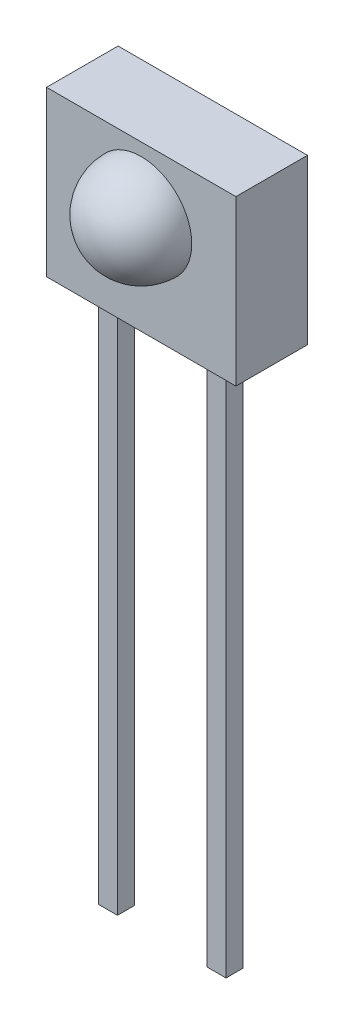
ISO-10303-21;
HEADER;
FILE_DESCRIPTION(('STEP AP214'),'2;1');
FILE_NAME('part.step','',(''),(''),'','','');
FILE_SCHEMA(('AUTOMOTIVE_DESIGN { 1 0 10303 214 1 1 1 1 }'));
ENDSEC;
DATA;
#1=APPLICATION_CONTEXT('core data for automotive mechanical design processes');
#2=APPLICATION_PROTOCOL_DEFINITION('international standard','automotive_design',2000,#1);
#3=PRODUCT_CONTEXT('',#1,'mechanical');
#4=PRODUCT('Part','Part','',(#3));
#5=PRODUCT_RELATED_PRODUCT_CATEGORY('part','',(#4));
#6=PRODUCT_DEFINITION_FORMATION('','',#4);
#7=PRODUCT_DEFINITION_CONTEXT('part definition',#1,'design');
#8=PRODUCT_DEFINITION('design','',#6,#7);
#9=PRODUCT_DEFINITION_SHAPE('','',#8);
#10=(LENGTH_UNIT() NAMED_UNIT(*) SI_UNIT(.MILLI.,.METRE.));
#11=(NAMED_UNIT(*) PLANE_ANGLE_UNIT() SI_UNIT($,.RADIAN.));
#12=(NAMED_UNIT(*) SI_UNIT($,.STERADIAN.) SOLID_ANGLE_UNIT());
#13=UNCERTAINTY_MEASURE_WITH_UNIT(LENGTH_MEASURE(1.E-05),#10,'distance_accuracy_value','');
#14=(GEOMETRIC_REPRESENTATION_CONTEXT(3) GLOBAL_UNCERTAINTY_ASSIGNED_CONTEXT((#13)) GLOBAL_UNIT_ASSIGNED_CONTEXT((#10,
#11,#12)) REPRESENTATION_CONTEXT('',''));
#15=CARTESIAN_POINT('',(0.,0.,0.));
#16=DIRECTION('',(0.,0.,1.));
#17=DIRECTION('',(1.,0.,0.));
#18=AXIS2_PLACEMENT_3D('',#15,#16,#17);
#19=CARTESIAN_POINT('',(-2.25,-1.95,-1.7));
#20=DIRECTION('',(0.,-1.,0.));
#21=DIRECTION('',(0.,0.,-1.));
#22=AXIS2_PLACEMENT_3D('',#19,#20,#21);
#23=PLANE('',#22);
#24=DIRECTION('',(0.,0.,-1.));
#25=VECTOR('',#24,1.);
#26=CARTESIAN_POINT('',(-1.065,-1.95,-0.5));
#27=LINE('',#26,#25);
#28=CARTESIAN_POINT('',(-1.065,-1.95,-0.5));
#29=VERTEX_POINT('',#28);
#30=CARTESIAN_POINT('',(-1.065,-1.95,-0.9));
#31=VERTEX_POINT('',#30);
#32=EDGE_CURVE('E124',#29,#31,#27,.T.);
#33=ORIENTED_EDGE('',*,*,#32,.T.);
#34=DIRECTION('',(-1.,0.,0.));
#35=VECTOR('',#34,1.);
#36=CARTESIAN_POINT('',(-1.065,-1.95,-0.9));
#37=LINE('',#36,#35);
#38=CARTESIAN_POINT('',(-1.515,-1.95,-0.9));
#39=VERTEX_POINT('',#38);
#40=EDGE_CURVE('E138',#31,#39,#37,.T.);
#41=ORIENTED_EDGE('',*,*,#40,.T.);
#42=DIRECTION('',(0.,0.,1.));
#43=VECTOR('',#42,1.);
#44=CARTESIAN_POINT('',(-1.515,-1.95,-0.5));
#45=LINE('',#44,#43);
#46=CARTESIAN_POINT('',(-1.515,-1.95,-0.5));
#47=VERTEX_POINT('',#46);
#48=EDGE_CURVE('E50',#39,#47,#45,.T.);
#49=ORIENTED_EDGE('',*,*,#48,.T.);
#50=DIRECTION('',(1.,0.,0.));
#51=VECTOR('',#50,1.);
#52=CARTESIAN_POINT('',(-1.065,-1.95,-0.5));
#53=LINE('',#52,#51);
#54=EDGE_CURVE('E45',#47,#29,#53,.T.);
#55=ORIENTED_EDGE('',*,*,#54,.T.);
#56=EDGE_LOOP('',(#33,#41,#49,#55));
#57=FACE_BOUND('',#56,.T.);
#58=DIRECTION('',(1.,0.,0.));
#59=VECTOR('',#58,1.);
#60=CARTESIAN_POINT('',(-2.25,-1.95,0.));
#61=LINE('',#60,#59);
#62=CARTESIAN_POINT('',(-2.25,-1.95,0.));
#63=VERTEX_POINT('',#62);
#64=CARTESIAN_POINT('',(2.25,-1.95,0.));
#65=VERTEX_POINT('',#64);
#66=EDGE_CURVE('E201',#63,#65,#61,.T.);
#67=ORIENTED_EDGE('',*,*,#66,.F.);
#68=DIRECTION('',(0.,0.,1.));
#69=VECTOR('',#68,1.);
#70=CARTESIAN_POINT('',(-2.25,-1.95,-1.7));
#71=LINE('',#70,#69);
#72=CARTESIAN_POINT('',(-2.25,-1.95,-1.7));
#73=VERTEX_POINT('',#72);
#74=EDGE_CURVE('E198',#73,#63,#71,.T.);
#75=ORIENTED_EDGE('',*,*,#74,.F.);
#76=DIRECTION('',(1.,0.,0.));
#77=VECTOR('',#76,1.);
#78=CARTESIAN_POINT('',(-2.25,-1.95,-1.7));
#79=LINE('',#78,#77);
#80=CARTESIAN_POINT('',(2.25,-1.95,-1.7));
#81=VERTEX_POINT('',#80);
#82=EDGE_CURVE('E188',#73,#81,#79,.T.);
#83=ORIENTED_EDGE('',*,*,#82,.T.);
#84=DIRECTION('',(0.,0.,1.));
#85=VECTOR('',#84,1.);
#86=CARTESIAN_POINT('',(2.25,-1.95,-1.7));
#87=LINE('',#86,#85);
#88=EDGE_CURVE('E212',#81,#65,#87,.T.);
#89=ORIENTED_EDGE('',*,*,#88,.T.);
#90=EDGE_LOOP('',(#67,#75,#83,#89));
#91=FACE_BOUND('',#90,.T.);
#92=DIRECTION('',(1.,0.,0.));
#93=VECTOR('',#92,1.);
#94=CARTESIAN_POINT('',(1.065,-1.95,-0.9));
#95=LINE('',#94,#93);
#96=CARTESIAN_POINT('',(1.065,-1.95,-0.9));
#97=VERTEX_POINT('',#96);
#98=CARTESIAN_POINT('',(1.515,-1.95,-0.9));
#99=VERTEX_POINT('',#98);
#100=EDGE_CURVE('E169',#97,#99,#95,.T.);
#101=ORIENTED_EDGE('',*,*,#100,.F.);
#102=DIRECTION('',(0.,0.,-1.));
#103=VECTOR('',#102,1.);
#104=CARTESIAN_POINT('',(1.065,-1.95,-0.5));
#105=LINE('',#104,#103);
#106=CARTESIAN_POINT('',(1.065,-1.95,-0.5));
#107=VERTEX_POINT('',#106);
#108=EDGE_CURVE('E127',#107,#97,#105,.T.);
#109=ORIENTED_EDGE('',*,*,#108,.F.);
#110=DIRECTION('',(-1.,0.,0.));
#111=VECTOR('',#110,1.);
#112=CARTESIAN_POINT('',(1.065,-1.95,-0.5));
#113=LINE('',#112,#111);
#114=CARTESIAN_POINT('',(1.515,-1.95,-0.5));
#115=VERTEX_POINT('',#114);
#116=EDGE_CURVE('E160',#115,#107,#113,.T.);
#117=ORIENTED_EDGE('',*,*,#116,.F.);
#118=DIRECTION('',(0.,0.,1.));
#119=VECTOR('',#118,1.);
#120=CARTESIAN_POINT('',(1.515,-1.95,-0.5));
#121=LINE('',#120,#119);
#122=EDGE_CURVE('E171',#99,#115,#121,.T.);
#123=ORIENTED_EDGE('',*,*,#122,.F.);
#124=EDGE_LOOP('',(#101,#109,#117,#123));
#125=FACE_BOUND('',#124,.T.);
#126=ADVANCED_FACE('F30',(#57,#91,#125),#23,.T.);
#127=CARTESIAN_POINT('',(-2.25,1.95,0.));
#128=DIRECTION('',(0.,0.,-1.));
#129=DIRECTION('',(-1.,0.,0.));
#130=AXIS2_PLACEMENT_3D('',#127,#128,#129);
#131=PLANE('',#130);
#132=DIRECTION('',(0.,-1.,0.));
#133=VECTOR('',#132,1.);
#134=CARTESIAN_POINT('',(-2.25,-1.95,0.));
#135=LINE('',#134,#133);
#136=CARTESIAN_POINT('',(-2.25,1.95,0.));
#137=VERTEX_POINT('',#136);
#138=EDGE_CURVE('E184',#137,#63,#135,.T.);
#139=ORIENTED_EDGE('',*,*,#138,.T.);
#140=ORIENTED_EDGE('',*,*,#66,.T.);
#141=DIRECTION('',(0.,1.,0.));
#142=VECTOR('',#141,1.);
#143=CARTESIAN_POINT('',(2.25,-1.95,0.));
#144=LINE('',#143,#142);
#145=CARTESIAN_POINT('',(2.25000000000001,1.95,0.));
#146=VERTEX_POINT('',#145);
#147=EDGE_CURVE('E204',#65,#146,#144,.T.);
#148=ORIENTED_EDGE('',*,*,#147,.T.);
#149=DIRECTION('',(-1.,0.,0.));
#150=VECTOR('',#149,1.);
#151=CARTESIAN_POINT('',(-2.25,1.95,0.));
#152=LINE('',#151,#150);
#153=EDGE_CURVE('E189',#146,#137,#152,.T.);
#154=ORIENTED_EDGE('',*,*,#153,.T.);
#155=EDGE_LOOP('',(#139,#140,#148,#154));
#156=FACE_BOUND('',#155,.T.);
#157=CARTESIAN_POINT('',(0.,0.449999999999996,0.));
#158=DIRECTION('',(0.,0.,-1.));
#159=DIRECTION('',(-1.,0.,0.));
#160=AXIS2_PLACEMENT_3D('',#157,#158,#159);
#161=CIRCLE('',#160,1.2);
#162=CARTESIAN_POINT('',(-1.2,0.449999999999996,0.));
#163=VERTEX_POINT('',#162);
#164=EDGE_CURVE('E11',#163,#163,#161,.F.);
#165=ORIENTED_EDGE('',*,*,#164,.F.);
#166=EDGE_LOOP('',(#165));
#167=FACE_BOUND('',#166,.T.);
#168=ADVANCED_FACE('F223',(#156,#167),#131,.F.);
#169=CARTESIAN_POINT('',(-2.25,-1.95,-1.7));
#170=DIRECTION('',(-1.,0.,0.));
#171=DIRECTION('',(0.,0.,1.));
#172=AXIS2_PLACEMENT_3D('',#169,#170,#171);
#173=PLANE('',#172);
#174=ORIENTED_EDGE('',*,*,#138,.F.);
#175=DIRECTION('',(0.,0.,1.));
#176=VECTOR('',#175,1.);
#177=CARTESIAN_POINT('',(-2.25,1.95,-1.7));
#178=LINE('',#177,#176);
#179=CARTESIAN_POINT('',(-2.25,1.95,-1.7));
#180=VERTEX_POINT('',#179);
#181=EDGE_CURVE('E38',#180,#137,#178,.T.);
#182=ORIENTED_EDGE('',*,*,#181,.F.);
#183=DIRECTION('',(0.,-1.,0.));
#184=VECTOR('',#183,1.);
#185=CARTESIAN_POINT('',(-2.25,-1.95,-1.7));
#186=LINE('',#185,#184);
#187=EDGE_CURVE('E185',#180,#73,#186,.T.);
#188=ORIENTED_EDGE('',*,*,#187,.T.);
#189=ORIENTED_EDGE('',*,*,#74,.T.);
#190=EDGE_LOOP('',(#174,#182,#188,#189));
#191=FACE_BOUND('',#190,.T.);
#192=ADVANCED_FACE('F216',(#191),#173,.T.);
#193=CARTESIAN_POINT('',(-2.25,1.95,-1.7));
#194=DIRECTION('',(0.,1.,0.));
#195=DIRECTION('',(0.,0.,1.));
#196=AXIS2_PLACEMENT_3D('',#193,#194,#195);
#197=PLANE('',#196);
#198=ORIENTED_EDGE('',*,*,#153,.F.);
#199=DIRECTION('',(0.,0.,1.));
#200=VECTOR('',#199,1.);
#201=CARTESIAN_POINT('',(2.25000000000001,1.95,-1.7));
#202=LINE('',#201,#200);
#203=CARTESIAN_POINT('',(2.25000000000001,1.95,-1.7));
#204=VERTEX_POINT('',#203);
#205=EDGE_CURVE('E210',#204,#146,#202,.T.);
#206=ORIENTED_EDGE('',*,*,#205,.F.);
#207=DIRECTION('',(-1.,0.,0.));
#208=VECTOR('',#207,1.);
#209=CARTESIAN_POINT('',(-2.25,1.95,-1.7));
#210=LINE('',#209,#208);
#211=EDGE_CURVE('E195',#204,#180,#210,.T.);
#212=ORIENTED_EDGE('',*,*,#211,.T.);
#213=ORIENTED_EDGE('',*,*,#181,.T.);
#214=EDGE_LOOP('',(#198,#206,#212,#213));
#215=FACE_BOUND('',#214,.T.);
#216=ADVANCED_FACE('F227',(#215),#197,.T.);
#217=CARTESIAN_POINT('',(2.25,-1.95,-1.7));
#218=DIRECTION('',(1.,0.,0.));
#219=DIRECTION('',(0.,1.,0.));
#220=AXIS2_PLACEMENT_3D('',#217,#218,#219);
#221=PLANE('',#220);
#222=ORIENTED_EDGE('',*,*,#147,.F.);
#223=ORIENTED_EDGE('',*,*,#88,.F.);
#224=DIRECTION('',(0.,1.,0.));
#225=VECTOR('',#224,1.);
#226=CARTESIAN_POINT('',(2.25,-1.95,-1.7));
#227=LINE('',#226,#225);
#228=EDGE_CURVE('E192',#81,#204,#227,.T.);
#229=ORIENTED_EDGE('',*,*,#228,.T.);
#230=ORIENTED_EDGE('',*,*,#205,.T.);
#231=EDGE_LOOP('',(#222,#223,#229,#230));
#232=FACE_BOUND('',#231,.T.);
#233=ADVANCED_FACE('F233',(#232),#221,.T.);
#234=CARTESIAN_POINT('',(-2.25,1.95,-1.7));
#235=DIRECTION('',(0.,0.,-1.));
#236=DIRECTION('',(-1.,0.,0.));
#237=AXIS2_PLACEMENT_3D('',#234,#235,#236);
#238=PLANE('',#237);
#239=ORIENTED_EDGE('',*,*,#187,.F.);
#240=ORIENTED_EDGE('',*,*,#211,.F.);
#241=ORIENTED_EDGE('',*,*,#228,.F.);
#242=ORIENTED_EDGE('',*,*,#82,.F.);
#243=EDGE_LOOP('',(#239,#240,#241,#242));
#244=FACE_BOUND('',#243,.T.);
#245=ADVANCED_FACE('F230',(#244),#238,.T.);
#246=CARTESIAN_POINT('',(0.,0.449999999999996,0.));
#247=DIRECTION('',(0.,0.,1.));
#248=DIRECTION('',(1.,0.,0.));
#249=AXIS2_PLACEMENT_3D('',#246,#247,#248);
#250=SPHERICAL_SURFACE('',#249,1.2);
#251=ORIENTED_EDGE('',*,*,#164,.T.);
#252=EDGE_LOOP('',(#251));
#253=FACE_BOUND('',#252,.T.);
#254=ADVANCED_FACE('F32',(#253),#250,.T.);
#255=CARTESIAN_POINT('',(1.065,-14.75,-0.5));
#256=DIRECTION('',(1.,0.,0.));
#257=DIRECTION('',(0.,0.,-1.));
#258=AXIS2_PLACEMENT_3D('',#255,#256,#257);
#259=PLANE('',#258);
#260=ORIENTED_EDGE('',*,*,#108,.T.);
#261=DIRECTION('',(0.,1.,0.));
#262=VECTOR('',#261,1.);
#263=CARTESIAN_POINT('',(1.065,-14.75,-0.9));
#264=LINE('',#263,#262);
#265=CARTESIAN_POINT('',(1.065,-14.75,-0.9));
#266=VERTEX_POINT('',#265);
#267=EDGE_CURVE('E182',#266,#97,#264,.T.);
#268=ORIENTED_EDGE('',*,*,#267,.F.);
#269=DIRECTION('',(0.,0.,-1.));
#270=VECTOR('',#269,1.);
#271=CARTESIAN_POINT('',(1.065,-14.75,-0.5));
#272=LINE('',#271,#270);
#273=CARTESIAN_POINT('',(1.065,-14.75,-0.5));
#274=VERTEX_POINT('',#273);
#275=EDGE_CURVE('E156',#274,#266,#272,.T.);
#276=ORIENTED_EDGE('',*,*,#275,.F.);
#277=DIRECTION('',(0.,1.,0.));
#278=VECTOR('',#277,1.);
#279=CARTESIAN_POINT('',(1.065,-14.75,-0.5));
#280=LINE('',#279,#278);
#281=EDGE_CURVE('E166',#274,#107,#280,.T.);
#282=ORIENTED_EDGE('',*,*,#281,.T.);
#283=EDGE_LOOP('',(#260,#268,#276,#282));
#284=FACE_BOUND('',#283,.T.);
#285=ADVANCED_FACE('F280',(#284),#259,.F.);
#286=CARTESIAN_POINT('',(1.065,-14.75,-0.9));
#287=DIRECTION('',(0.,0.,1.));
#288=DIRECTION('',(1.,0.,0.));
#289=AXIS2_PLACEMENT_3D('',#286,#287,#288);
#290=PLANE('',#289);
#291=ORIENTED_EDGE('',*,*,#100,.T.);
#292=DIRECTION('',(0.,1.,0.));
#293=VECTOR('',#292,1.);
#294=CARTESIAN_POINT('',(1.515,-14.75,-0.9));
#295=LINE('',#294,#293);
#296=CARTESIAN_POINT('',(1.515,-14.75,-0.9));
#297=VERTEX_POINT('',#296);
#298=EDGE_CURVE('E179',#297,#99,#295,.T.);
#299=ORIENTED_EDGE('',*,*,#298,.F.);
#300=DIRECTION('',(1.,0.,0.));
#301=VECTOR('',#300,1.);
#302=CARTESIAN_POINT('',(1.065,-14.75,-0.9));
#303=LINE('',#302,#301);
#304=EDGE_CURVE('E159',#266,#297,#303,.T.);
#305=ORIENTED_EDGE('',*,*,#304,.F.);
#306=ORIENTED_EDGE('',*,*,#267,.T.);
#307=EDGE_LOOP('',(#291,#299,#305,#306));
#308=FACE_BOUND('',#307,.T.);
#309=ADVANCED_FACE('F290',(#308),#290,.F.);
#310=CARTESIAN_POINT('',(1.515,-14.75,-0.5));
#311=DIRECTION('',(-1.,0.,0.));
#312=DIRECTION('',(0.,0.,1.));
#313=AXIS2_PLACEMENT_3D('',#310,#311,#312);
#314=PLANE('',#313);
#315=ORIENTED_EDGE('',*,*,#122,.T.);
#316=DIRECTION('',(0.,1.,0.));
#317=VECTOR('',#316,1.);
#318=CARTESIAN_POINT('',(1.515,-14.75,-0.5));
#319=LINE('',#318,#317);
#320=CARTESIAN_POINT('',(1.515,-14.75,-0.5));
#321=VERTEX_POINT('',#320);
#322=EDGE_CURVE('E177',#321,#115,#319,.T.);
#323=ORIENTED_EDGE('',*,*,#322,.F.);
#324=DIRECTION('',(0.,0.,1.));
#325=VECTOR('',#324,1.);
#326=CARTESIAN_POINT('',(1.515,-14.75,-0.5));
#327=LINE('',#326,#325);
#328=EDGE_CURVE('E162',#297,#321,#327,.T.);
#329=ORIENTED_EDGE('',*,*,#328,.F.);
#330=ORIENTED_EDGE('',*,*,#298,.T.);
#331=EDGE_LOOP('',(#315,#323,#329,#330));
#332=FACE_BOUND('',#331,.T.);
#333=ADVANCED_FACE('F300',(#332),#314,.F.);
#334=CARTESIAN_POINT('',(1.065,-14.75,-0.5));
#335=DIRECTION('',(0.,0.,-1.));
#336=DIRECTION('',(-1.,0.,0.));
#337=AXIS2_PLACEMENT_3D('',#334,#335,#336);
#338=PLANE('',#337);
#339=ORIENTED_EDGE('',*,*,#116,.T.);
#340=ORIENTED_EDGE('',*,*,#281,.F.);
#341=DIRECTION('',(-1.,0.,0.));
#342=VECTOR('',#341,1.);
#343=CARTESIAN_POINT('',(1.065,-14.75,-0.5));
#344=LINE('',#343,#342);
#345=EDGE_CURVE('E164',#321,#274,#344,.T.);
#346=ORIENTED_EDGE('',*,*,#345,.F.);
#347=ORIENTED_EDGE('',*,*,#322,.T.);
#348=EDGE_LOOP('',(#339,#340,#346,#347));
#349=FACE_BOUND('',#348,.T.);
#350=ADVANCED_FACE('F310',(#349),#338,.F.);
#351=CARTESIAN_POINT('',(1.065,-14.75,-0.9));
#352=DIRECTION('',(0.,-1.,0.));
#353=DIRECTION('',(0.,0.,-1.));
#354=AXIS2_PLACEMENT_3D('',#351,#352,#353);
#355=PLANE('',#354);
#356=ORIENTED_EDGE('',*,*,#275,.T.);
#357=ORIENTED_EDGE('',*,*,#304,.T.);
#358=ORIENTED_EDGE('',*,*,#328,.T.);
#359=ORIENTED_EDGE('',*,*,#345,.T.);
#360=EDGE_LOOP('',(#356,#357,#358,#359));
#361=FACE_BOUND('',#360,.T.);
#362=ADVANCED_FACE('F320',(#361),#355,.T.);
#363=CARTESIAN_POINT('',(-1.065,-14.75,-0.5));
#364=DIRECTION('',(1.,0.,0.));
#365=DIRECTION('',(0.,0.,-1.));
#366=AXIS2_PLACEMENT_3D('',#363,#364,#365);
#367=PLANE('',#366);
#368=ORIENTED_EDGE('',*,*,#32,.F.);
#369=DIRECTION('',(0.,1.,0.));
#370=VECTOR('',#369,1.);
#371=CARTESIAN_POINT('',(-1.065,-14.75,-0.5));
#372=LINE('',#371,#370);
#373=CARTESIAN_POINT('',(-1.065,-14.75,-0.5));
#374=VERTEX_POINT('',#373);
#375=EDGE_CURVE('E118',#374,#29,#372,.T.);
#376=ORIENTED_EDGE('',*,*,#375,.F.);
#377=DIRECTION('',(0.,0.,-1.));
#378=VECTOR('',#377,1.);
#379=CARTESIAN_POINT('',(-1.065,-14.75,-0.5));
#380=LINE('',#379,#378);
#381=CARTESIAN_POINT('',(-1.065,-14.75,-0.9));
#382=VERTEX_POINT('',#381);
#383=EDGE_CURVE('E122',#374,#382,#380,.T.);
#384=ORIENTED_EDGE('',*,*,#383,.T.);
#385=DIRECTION('',(0.,1.,0.));
#386=VECTOR('',#385,1.);
#387=CARTESIAN_POINT('',(-1.065,-14.75,-0.9));
#388=LINE('',#387,#386);
#389=EDGE_CURVE('E146',#382,#31,#388,.T.);
#390=ORIENTED_EDGE('',*,*,#389,.T.);
#391=EDGE_LOOP('',(#368,#376,#384,#390));
#392=FACE_BOUND('',#391,.T.);
#393=ADVANCED_FACE('F120',(#392),#367,.T.);
#394=CARTESIAN_POINT('',(-1.065,-14.75,-0.5));
#395=DIRECTION('',(0.,0.,1.));
#396=DIRECTION('',(1.,0.,0.));
#397=AXIS2_PLACEMENT_3D('',#394,#395,#396);
#398=PLANE('',#397);
#399=ORIENTED_EDGE('',*,*,#54,.F.);
#400=DIRECTION('',(0.,1.,0.));
#401=VECTOR('',#400,1.);
#402=CARTESIAN_POINT('',(-1.515,-14.75,-0.5));
#403=LINE('',#402,#401);
#404=CARTESIAN_POINT('',(-1.515,-14.75,-0.5));
#405=VERTEX_POINT('',#404);
#406=EDGE_CURVE('E128',#405,#47,#403,.T.);
#407=ORIENTED_EDGE('',*,*,#406,.F.);
#408=DIRECTION('',(1.,0.,0.));
#409=VECTOR('',#408,1.);
#410=CARTESIAN_POINT('',(-1.065,-14.75,-0.5));
#411=LINE('',#410,#409);
#412=EDGE_CURVE('E134',#405,#374,#411,.T.);
#413=ORIENTED_EDGE('',*,*,#412,.T.);
#414=ORIENTED_EDGE('',*,*,#375,.T.);
#415=EDGE_LOOP('',(#399,#407,#413,#414));
#416=FACE_BOUND('',#415,.T.);
#417=ADVANCED_FACE('F140',(#416),#398,.T.);
#418=CARTESIAN_POINT('',(-1.515,-14.75,-0.5));
#419=DIRECTION('',(-1.,0.,0.));
#420=DIRECTION('',(0.,0.,1.));
#421=AXIS2_PLACEMENT_3D('',#418,#419,#420);
#422=PLANE('',#421);
#423=ORIENTED_EDGE('',*,*,#48,.F.);
#424=DIRECTION('',(0.,1.,0.));
#425=VECTOR('',#424,1.);
#426=CARTESIAN_POINT('',(-1.515,-14.75,-0.9));
#427=LINE('',#426,#425);
#428=CARTESIAN_POINT('',(-1.515,-14.75,-0.9));
#429=VERTEX_POINT('',#428);
#430=EDGE_CURVE('E152',#429,#39,#427,.T.);
#431=ORIENTED_EDGE('',*,*,#430,.F.);
#432=DIRECTION('',(0.,0.,1.));
#433=VECTOR('',#432,1.);
#434=CARTESIAN_POINT('',(-1.515,-14.75,-0.5));
#435=LINE('',#434,#433);
#436=EDGE_CURVE('E141',#429,#405,#435,.T.);
#437=ORIENTED_EDGE('',*,*,#436,.T.);
#438=ORIENTED_EDGE('',*,*,#406,.T.);
#439=EDGE_LOOP('',(#423,#431,#437,#438));
#440=FACE_BOUND('',#439,.T.);
#441=ADVANCED_FACE('F350',(#440),#422,.T.);
#442=CARTESIAN_POINT('',(-1.065,-14.75,-0.9));
#443=DIRECTION('',(0.,0.,-1.));
#444=DIRECTION('',(-1.,0.,0.));
#445=AXIS2_PLACEMENT_3D('',#442,#443,#444);
#446=PLANE('',#445);
#447=ORIENTED_EDGE('',*,*,#40,.F.);
#448=ORIENTED_EDGE('',*,*,#389,.F.);
#449=DIRECTION('',(-1.,0.,0.));
#450=VECTOR('',#449,1.);
#451=CARTESIAN_POINT('',(-1.065,-14.75,-0.9));
#452=LINE('',#451,#450);
#453=EDGE_CURVE('E137',#382,#429,#452,.T.);
#454=ORIENTED_EDGE('',*,*,#453,.T.);
#455=ORIENTED_EDGE('',*,*,#430,.T.);
#456=EDGE_LOOP('',(#447,#448,#454,#455));
#457=FACE_BOUND('',#456,.T.);
#458=ADVANCED_FACE('F359',(#457),#446,.T.);
#459=CARTESIAN_POINT('',(-1.065,-14.75,-0.9));
#460=DIRECTION('',(0.,-1.,0.));
#461=DIRECTION('',(0.,0.,-1.));
#462=AXIS2_PLACEMENT_3D('',#459,#460,#461);
#463=PLANE('',#462);
#464=ORIENTED_EDGE('',*,*,#383,.F.);
#465=ORIENTED_EDGE('',*,*,#412,.F.);
#466=ORIENTED_EDGE('',*,*,#436,.F.);
#467=ORIENTED_EDGE('',*,*,#453,.F.);
#468=EDGE_LOOP('',(#464,#465,#466,#467));
#469=FACE_BOUND('',#468,.T.);
#470=ADVANCED_FACE('F132',(#469),#463,.T.);
#471=CLOSED_SHELL('',(#126,#168,#192,#216,#233,#245,#254,#285,#309,#333,#350,#362,#393,#417,
#441,#458,#470));
#472=MANIFOLD_SOLID_BREP('B2',#471);
#473=ADVANCED_BREP_SHAPE_REPRESENTATION('',(#18,#472),#14);
#474=SHAPE_DEFINITION_REPRESENTATION(#9,#473);
ENDSEC;
END-ISO-10303-21;
